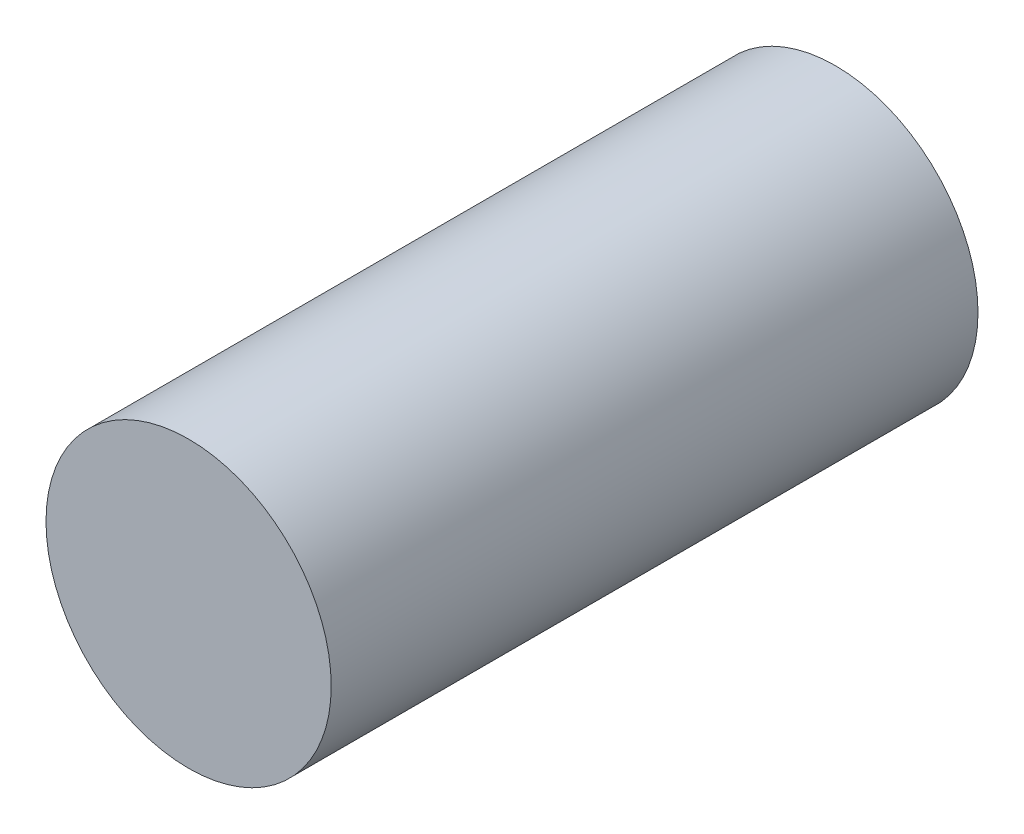
ISO-10303-21;
HEADER;
FILE_DESCRIPTION(('STEP AP214'),'2;1');
FILE_NAME('part.step','',(''),(''),'','','');
FILE_SCHEMA(('AUTOMOTIVE_DESIGN { 1 0 10303 214 1 1 1 1 }'));
ENDSEC;
DATA;
#1=APPLICATION_CONTEXT('core data for automotive mechanical design processes');
#2=APPLICATION_PROTOCOL_DEFINITION('international standard','automotive_design',2000,#1);
#3=PRODUCT_CONTEXT('',#1,'mechanical');
#4=PRODUCT('Part','Part','',(#3));
#5=PRODUCT_RELATED_PRODUCT_CATEGORY('part','',(#4));
#6=PRODUCT_DEFINITION_FORMATION('','',#4);
#7=PRODUCT_DEFINITION_CONTEXT('part definition',#1,'design');
#8=PRODUCT_DEFINITION('design','',#6,#7);
#9=PRODUCT_DEFINITION_SHAPE('','',#8);
#10=(LENGTH_UNIT() NAMED_UNIT(*) SI_UNIT(.MILLI.,.METRE.));
#11=(NAMED_UNIT(*) PLANE_ANGLE_UNIT() SI_UNIT($,.RADIAN.));
#12=(NAMED_UNIT(*) SI_UNIT($,.STERADIAN.) SOLID_ANGLE_UNIT());
#13=UNCERTAINTY_MEASURE_WITH_UNIT(LENGTH_MEASURE(1.E-05),#10,'distance_accuracy_value','');
#14=(GEOMETRIC_REPRESENTATION_CONTEXT(3) GLOBAL_UNCERTAINTY_ASSIGNED_CONTEXT((#13)) GLOBAL_UNIT_ASSIGNED_CONTEXT((#10,
#11,#12)) REPRESENTATION_CONTEXT('',''));
#15=CARTESIAN_POINT('',(0.,0.,0.));
#16=DIRECTION('',(0.,0.,1.));
#17=DIRECTION('',(1.,0.,0.));
#18=AXIS2_PLACEMENT_3D('',#15,#16,#17);
#19=CARTESIAN_POINT('',(0.,0.,122.682));
#20=DIRECTION('',(0.,0.,-1.));
#21=DIRECTION('',(-1.,0.,0.));
#22=AXIS2_PLACEMENT_3D('',#19,#20,#21);
#23=CYLINDRICAL_SURFACE('',#22,27.051);
#24=CARTESIAN_POINT('',(0.,0.,122.682));
#25=DIRECTION('',(0.,0.,1.));
#26=DIRECTION('',(1.,0.,0.));
#27=AXIS2_PLACEMENT_3D('',#24,#25,#26);
#28=CIRCLE('',#27,27.051);
#29=CARTESIAN_POINT('',(27.051,0.,122.682));
#30=VERTEX_POINT('',#29);
#31=EDGE_CURVE('E10',#30,#30,#28,.T.);
#32=ORIENTED_EDGE('',*,*,#31,.F.);
#33=EDGE_LOOP('',(#32));
#34=FACE_BOUND('',#33,.T.);
#35=CARTESIAN_POINT('',(0.,0.,0.));
#36=DIRECTION('',(0.,0.,1.));
#37=DIRECTION('',(1.,0.,0.));
#38=AXIS2_PLACEMENT_3D('',#35,#36,#37);
#39=CIRCLE('',#38,27.051);
#40=CARTESIAN_POINT('',(27.051,0.,0.));
#41=VERTEX_POINT('',#40);
#42=EDGE_CURVE('E37',#41,#41,#39,.T.);
#43=ORIENTED_EDGE('',*,*,#42,.T.);
#44=EDGE_LOOP('',(#43));
#45=FACE_BOUND('',#44,.T.);
#46=ADVANCED_FACE('F34',(#34,#45),#23,.T.);
#47=CARTESIAN_POINT('',(0.,0.,122.682));
#48=DIRECTION('',(0.,0.,1.));
#49=DIRECTION('',(1.,0.,0.));
#50=AXIS2_PLACEMENT_3D('',#47,#48,#49);
#51=PLANE('',#50);
#52=ORIENTED_EDGE('',*,*,#31,.T.);
#53=EDGE_LOOP('',(#52));
#54=FACE_BOUND('',#53,.T.);
#55=ADVANCED_FACE('F49',(#54),#51,.T.);
#56=CARTESIAN_POINT('',(0.,0.,0.));
#57=DIRECTION('',(0.,0.,1.));
#58=DIRECTION('',(1.,0.,0.));
#59=AXIS2_PLACEMENT_3D('',#56,#57,#58);
#60=PLANE('',#59);
#61=ORIENTED_EDGE('',*,*,#42,.F.);
#62=EDGE_LOOP('',(#61));
#63=FACE_BOUND('',#62,.T.);
#64=ADVANCED_FACE('F47',(#63),#60,.F.);
#65=CLOSED_SHELL('',(#46,#55,#64));
#66=MANIFOLD_SOLID_BREP('B2',#65);
#67=ADVANCED_BREP_SHAPE_REPRESENTATION('',(#18,#66),#14);
#68=SHAPE_DEFINITION_REPRESENTATION(#9,#67);
ENDSEC;
END-ISO-10303-21;
